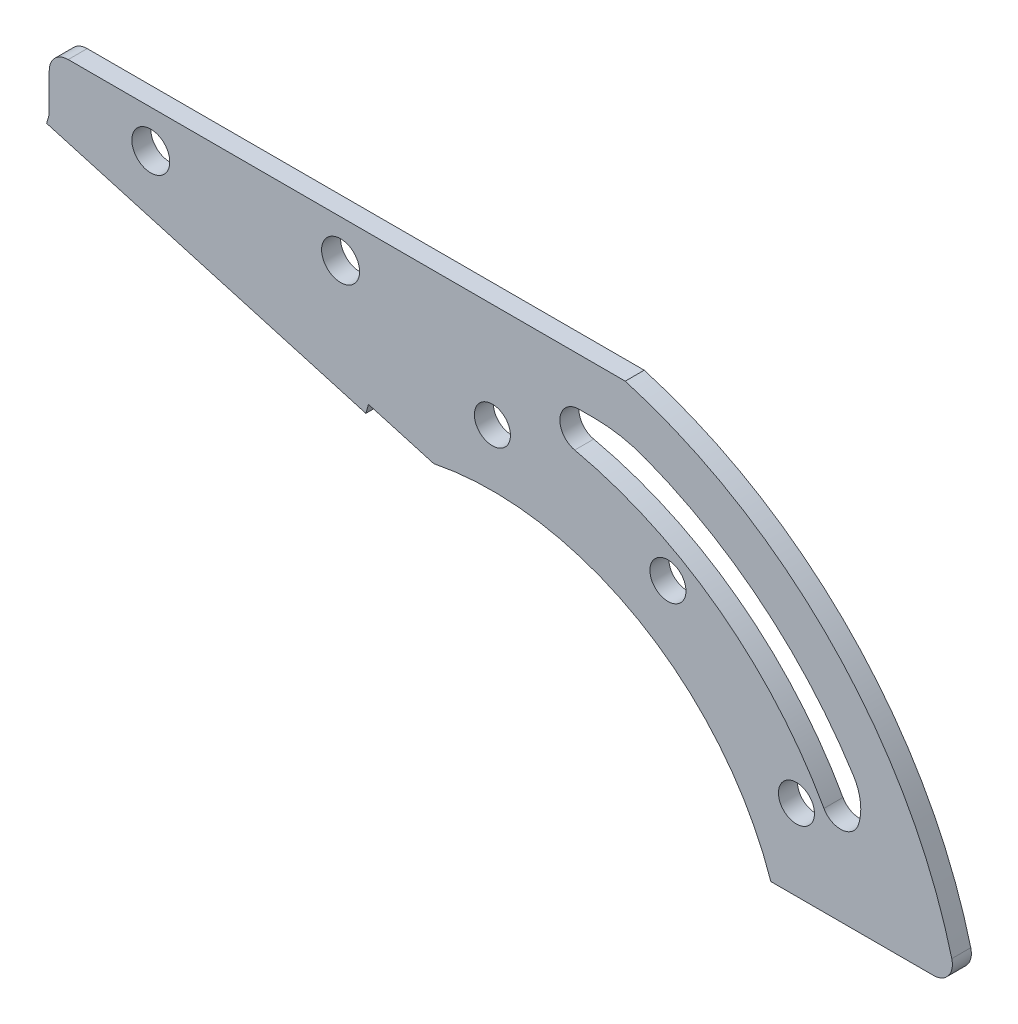
ISO-10303-21;
HEADER;
FILE_DESCRIPTION(('STEP AP214'),'2;1');
FILE_NAME('part.step','',(''),(''),'','','');
FILE_SCHEMA(('AUTOMOTIVE_DESIGN { 1 0 10303 214 1 1 1 1 }'));
ENDSEC;
DATA;
#1=APPLICATION_CONTEXT('core data for automotive mechanical design processes');
#2=APPLICATION_PROTOCOL_DEFINITION('international standard','automotive_design',2000,#1);
#3=PRODUCT_CONTEXT('',#1,'mechanical');
#4=PRODUCT('Part','Part','',(#3));
#5=PRODUCT_RELATED_PRODUCT_CATEGORY('part','',(#4));
#6=PRODUCT_DEFINITION_FORMATION('','',#4);
#7=PRODUCT_DEFINITION_CONTEXT('part definition',#1,'design');
#8=PRODUCT_DEFINITION('design','',#6,#7);
#9=PRODUCT_DEFINITION_SHAPE('','',#8);
#10=(LENGTH_UNIT() NAMED_UNIT(*) SI_UNIT(.MILLI.,.METRE.));
#11=(NAMED_UNIT(*) PLANE_ANGLE_UNIT() SI_UNIT($,.RADIAN.));
#12=(NAMED_UNIT(*) SI_UNIT($,.STERADIAN.) SOLID_ANGLE_UNIT());
#13=UNCERTAINTY_MEASURE_WITH_UNIT(LENGTH_MEASURE(1.E-05),#10,'distance_accuracy_value','');
#14=(GEOMETRIC_REPRESENTATION_CONTEXT(3) GLOBAL_UNCERTAINTY_ASSIGNED_CONTEXT((#13)) GLOBAL_UNIT_ASSIGNED_CONTEXT((#10,
#11,#12)) REPRESENTATION_CONTEXT('',''));
#15=CARTESIAN_POINT('',(0.,0.,0.));
#16=DIRECTION('',(0.,0.,1.));
#17=DIRECTION('',(1.,0.,0.));
#18=AXIS2_PLACEMENT_3D('',#15,#16,#17);
#19=CARTESIAN_POINT('',(0.,0.,0.));
#20=DIRECTION('',(0.,0.,1.));
#21=DIRECTION('',(1.,0.,0.));
#22=AXIS2_PLACEMENT_3D('',#19,#20,#21);
#23=PLANE('',#22);
#24=CARTESIAN_POINT('',(-32.2082171584964,16.055976509107,0.));
#25=DIRECTION('',(0.,0.,-1.));
#26=DIRECTION('',(-1.,0.,0.));
#27=AXIS2_PLACEMENT_3D('',#24,#25,#26);
#28=CIRCLE('',#27,1.99999999999423);
#29=CARTESIAN_POINT('',(-34.2082171584906,16.055976509107,0.));
#30=VERTEX_POINT('',#29);
#31=EDGE_CURVE('E405',#30,#30,#28,.T.);
#32=ORIENTED_EDGE('',*,*,#31,.F.);
#33=EDGE_LOOP('',(#32));
#34=FACE_BOUND('',#33,.T.);
#35=CARTESIAN_POINT('',(-12.2082171584964,16.055976509107,0.));
#36=DIRECTION('',(0.,0.,-1.));
#37=DIRECTION('',(-1.,0.,0.));
#38=AXIS2_PLACEMENT_3D('',#35,#36,#37);
#39=CIRCLE('',#38,1.99999999999423);
#40=CARTESIAN_POINT('',(-14.2082171584906,16.055976509107,0.));
#41=VERTEX_POINT('',#40);
#42=EDGE_CURVE('E409',#41,#41,#39,.T.);
#43=ORIENTED_EDGE('',*,*,#42,.F.);
#44=EDGE_LOOP('',(#43));
#45=FACE_BOUND('',#44,.T.);
#46=CARTESIAN_POINT('',(3.79178284150361,9.05597650910699,0.));
#47=DIRECTION('',(0.,0.,-1.));
#48=DIRECTION('',(-1.,0.,0.));
#49=AXIS2_PLACEMENT_3D('',#46,#47,#48);
#50=CIRCLE('',#49,1.89999999999423);
#51=CARTESIAN_POINT('',(1.89178284150939,9.05597650910699,0.));
#52=VERTEX_POINT('',#51);
#53=EDGE_CURVE('E413',#52,#52,#50,.T.);
#54=ORIENTED_EDGE('',*,*,#53,.F.);
#55=EDGE_LOOP('',(#54));
#56=FACE_BOUND('',#55,.T.);
#57=CARTESIAN_POINT('',(35.8347227815278,-9.44402349089302,0.));
#58=DIRECTION('',(0.,0.,-1.));
#59=DIRECTION('',(-1.,0.,0.));
#60=AXIS2_PLACEMENT_3D('',#57,#58,#59);
#61=CIRCLE('',#60,1.89999999999423);
#62=CARTESIAN_POINT('',(33.9347227815336,-9.44402349089302,0.));
#63=VERTEX_POINT('',#62);
#64=EDGE_CURVE('E417',#63,#63,#61,.T.);
#65=ORIENTED_EDGE('',*,*,#64,.F.);
#66=EDGE_LOOP('',(#65));
#67=FACE_BOUND('',#66,.T.);
#68=CARTESIAN_POINT('',(22.2917828415036,4.09891644913122,0.));
#69=DIRECTION('',(0.,0.,-1.));
#70=DIRECTION('',(-1.,0.,0.));
#71=AXIS2_PLACEMENT_3D('',#68,#69,#70);
#72=CIRCLE('',#71,1.89999999999423);
#73=CARTESIAN_POINT('',(20.3917828415094,4.09891644913122,0.));
#74=VERTEX_POINT('',#73);
#75=EDGE_CURVE('E226',#74,#74,#72,.T.);
#76=ORIENTED_EDGE('',*,*,#75,.F.);
#77=EDGE_LOOP('',(#76));
#78=FACE_BOUND('',#77,.T.);
#79=DIRECTION('',(-1.,0.,0.));
#80=VECTOR('',#79,1.);
#81=CARTESIAN_POINT('',(0.,15.055976509107,0.));
#82=LINE('',#81,#80);
#83=CARTESIAN_POINT('',(14.5621124557727,15.055976509107,0.));
#84=VERTEX_POINT('',#83);
#85=CARTESIAN_POINT('',(12.9022164206479,15.055976509107,0.));
#86=VERTEX_POINT('',#85);
#87=EDGE_CURVE('E240',#84,#86,#82,.T.);
#88=ORIENTED_EDGE('',*,*,#87,.T.);
#89=CARTESIAN_POINT('',(12.9022164206479,13.055976509107,0.));
#90=DIRECTION('',(0.,0.,-1.));
#91=DIRECTION('',(-1.,0.,0.));
#92=AXIS2_PLACEMENT_3D('',#89,#90,#91);
#93=CIRCLE('',#92,2.00000000000004);
#94=CARTESIAN_POINT('',(12.4683862502125,11.103595556726,0.));
#95=VERTEX_POINT('',#94);
#96=EDGE_CURVE('E214',#95,#86,#93,.T.);
#97=ORIENTED_EDGE('',*,*,#96,.F.);
#98=CARTESIAN_POINT('',(3.7917828415036,-27.944023490893,0.));
#99=DIRECTION('',(0.,0.,-1.));
#100=DIRECTION('',(-1.,0.,0.));
#101=AXIS2_PLACEMENT_3D('',#98,#99,#100);
#102=CIRCLE('',#101,39.9999999999999);
#103=CARTESIAN_POINT('',(38.7308562211329,-8.46939508948637,0.));
#104=VERTEX_POINT('',#103);
#105=EDGE_CURVE('E220',#95,#104,#102,.T.);
#106=ORIENTED_EDGE('',*,*,#105,.T.);
#107=CARTESIAN_POINT('',(40.4778098901144,-7.49566366941601,0.));
#108=DIRECTION('',(0.,0.,-1.));
#109=DIRECTION('',(-1.,0.,0.));
#110=AXIS2_PLACEMENT_3D('',#107,#108,#109);
#111=CIRCLE('',#110,2.00000000000007);
#112=CARTESIAN_POINT('',(42.3152259592522,-8.2855384625791,0.));
#113=VERTEX_POINT('',#112);
#114=EDGE_CURVE('E223',#113,#104,#111,.T.);
#115=ORIENTED_EDGE('',*,*,#114,.F.);
#116=CARTESIAN_POINT('',(37.6127420356404,-6.58652552908724,0.));
#117=DIRECTION('',(0.,0.,-1.));
#118=DIRECTION('',(-1.,0.,0.));
#119=AXIS2_PLACEMENT_3D('',#116,#117,#118);
#120=CIRCLE('',#119,5.);
#121=CARTESIAN_POINT('',(41.8403619349075,-3.91683828386151,0.));
#122=VERTEX_POINT('',#121);
#123=EDGE_CURVE('E249',#122,#113,#120,.T.);
#124=ORIENTED_EDGE('',*,*,#123,.F.);
#125=CARTESIAN_POINT('',(3.7917828415036,-27.944023490893,0.));
#126=DIRECTION('',(0.,0.,-1.));
#127=DIRECTION('',(-1.,0.,0.));
#128=AXIS2_PLACEMENT_3D('',#125,#126,#127);
#129=CIRCLE('',#128,45.);
#130=CARTESIAN_POINT('',(19.9472772629072,14.055976509107,0.));
#131=VERTEX_POINT('',#130);
#132=EDGE_CURVE('E246',#131,#122,#129,.T.);
#133=ORIENTED_EDGE('',*,*,#132,.F.);
#134=CARTESIAN_POINT('',(14.5621124557727,0.0559765091069954,0.));
#135=DIRECTION('',(0.,0.,-1.));
#136=DIRECTION('',(-1.,0.,0.));
#137=AXIS2_PLACEMENT_3D('',#134,#135,#136);
#138=CIRCLE('',#137,15.);
#139=EDGE_CURVE('E243',#84,#131,#138,.T.);
#140=ORIENTED_EDGE('',*,*,#139,.F.);
#141=EDGE_LOOP('',(#88,#97,#106,#115,#124,#133,#140));
#142=FACE_BOUND('',#141,.T.);
#143=CARTESIAN_POINT('',(50.2675829959926,-15.944023490893,0.));
#144=DIRECTION('',(0.,0.,-1.));
#145=DIRECTION('',(-1.,0.,0.));
#146=AXIS2_PLACEMENT_3D('',#143,#144,#145);
#147=CIRCLE('',#146,2.00000000000001);
#148=CARTESIAN_POINT('',(52.2040746690963,-15.444023490893,0.));
#149=VERTEX_POINT('',#148);
#150=CARTESIAN_POINT('',(50.2675829959926,-17.944023490893,0.));
#151=VERTEX_POINT('',#150);
#152=EDGE_CURVE('E256',#149,#151,#147,.T.);
#153=ORIENTED_EDGE('',*,*,#152,.T.);
#154=DIRECTION('',(-1.,0.,0.));
#155=VECTOR('',#154,1.);
#156=CARTESIAN_POINT('',(0.,-17.944023490893,0.));
#157=LINE('',#156,#155);
#158=CARTESIAN_POINT('',(33.134584343746,-17.944023490893,0.));
#159=VERTEX_POINT('',#158);
#160=EDGE_CURVE('E269',#151,#159,#157,.T.);
#161=ORIENTED_EDGE('',*,*,#160,.T.);
#162=CARTESIAN_POINT('',(3.7917828415036,-27.944023490893,0.));
#163=DIRECTION('',(0.,0.,-1.));
#164=DIRECTION('',(-1.,0.,0.));
#165=AXIS2_PLACEMENT_3D('',#162,#163,#164);
#166=CIRCLE('',#165,31.);
#167=CARTESIAN_POINT('',(-2.3829680921706,2.43479233374192,0.));
#168=VERTEX_POINT('',#167);
#169=EDGE_CURVE('E316',#168,#159,#166,.T.);
#170=ORIENTED_EDGE('',*,*,#169,.F.);
#171=DIRECTION('',(-0.961261695938321,0.275637355816991,0.));
#172=VECTOR('',#171,1.);
#173=CARTESIAN_POINT('',(0.464073411826669,1.61841631940691,0.));
#174=LINE('',#173,#172);
#175=CARTESIAN_POINT('',(-9.266694282034,4.40866905551224,0.));
#176=VERTEX_POINT('',#175);
#177=EDGE_CURVE('E313',#168,#176,#174,.T.);
#178=ORIENTED_EDGE('',*,*,#177,.T.);
#179=DIRECTION('',(-0.275637355816985,-0.961261695938323,0.));
#180=VECTOR('',#179,1.);
#181=CARTESIAN_POINT('',(-9.73076769386068,2.79025273610527,0.));
#182=LINE('',#181,#180);
#183=CARTESIAN_POINT('',(-9.54233163785098,3.44740735957393,0.));
#184=VERTEX_POINT('',#183);
#185=EDGE_CURVE('E310',#176,#184,#182,.T.);
#186=ORIENTED_EDGE('',*,*,#185,.T.);
#187=DIRECTION('',(-0.961261695938321,0.275637355816992,0.));
#188=VECTOR('',#187,1.);
#189=CARTESIAN_POINT('',(0.188436056009683,0.657154623468601,0.));
#190=LINE('',#189,#188);
#191=CARTESIAN_POINT('',(-43.1864909956922,13.0947148131687,0.));
#192=VERTEX_POINT('',#191);
#193=EDGE_CURVE('E307',#184,#192,#190,.T.);
#194=ORIENTED_EDGE('',*,*,#193,.T.);
#195=DIRECTION('',(0.275637355816996,0.96126169593832,0.));
#196=VECTOR('',#195,1.);
#197=CARTESIAN_POINT('',(-43.3749270517019,12.4375601897003,0.));
#198=LINE('',#197,#196);
#199=CARTESIAN_POINT('',(-42.9108536398752,14.055976509107,0.));
#200=VERTEX_POINT('',#199);
#201=EDGE_CURVE('E304',#192,#200,#198,.T.);
#202=ORIENTED_EDGE('',*,*,#201,.T.);
#203=DIRECTION('',(0.,1.,0.));
#204=VECTOR('',#203,1.);
#205=CARTESIAN_POINT('',(-42.9108536398752,0.,0.));
#206=LINE('',#205,#204);
#207=CARTESIAN_POINT('',(-42.9108536398752,18.055976509107,0.));
#208=VERTEX_POINT('',#207);
#209=EDGE_CURVE('E301',#200,#208,#206,.T.);
#210=ORIENTED_EDGE('',*,*,#209,.T.);
#211=CARTESIAN_POINT('',(-40.9108536398752,18.055976509107,0.));
#212=DIRECTION('',(0.,0.,-1.));
#213=DIRECTION('',(-1.,0.,0.));
#214=AXIS2_PLACEMENT_3D('',#211,#212,#213);
#215=CIRCLE('',#214,2.);
#216=CARTESIAN_POINT('',(-40.9108536398752,20.055976509107,0.));
#217=VERTEX_POINT('',#216);
#218=EDGE_CURVE('E298',#208,#217,#215,.T.);
#219=ORIENTED_EDGE('',*,*,#218,.T.);
#220=DIRECTION('',(1.,0.,0.));
#221=VECTOR('',#220,1.);
#222=CARTESIAN_POINT('',(0.,20.055976509107,0.));
#223=LINE('',#222,#221);
#224=CARTESIAN_POINT('',(17.7917828415037,20.055976509107,0.));
#225=VERTEX_POINT('',#224);
#226=EDGE_CURVE('E295',#217,#225,#223,.T.);
#227=ORIENTED_EDGE('',*,*,#226,.T.);
#228=CARTESIAN_POINT('',(3.7917828415036,-27.944023490893,0.));
#229=DIRECTION('',(0.,0.,-1.));
#230=DIRECTION('',(-1.,0.,0.));
#231=AXIS2_PLACEMENT_3D('',#228,#229,#230);
#232=CIRCLE('',#231,50.);
#233=EDGE_CURVE('E292',#225,#149,#232,.T.);
#234=ORIENTED_EDGE('',*,*,#233,.T.);
#235=EDGE_LOOP('',(#153,#161,#170,#178,#186,#194,#202,#210,#219,#227,#234));
#236=FACE_BOUND('',#235,.T.);
#237=ADVANCED_FACE('F72',(#34,#45,#56,#67,#78,#142,#236),#23,.F.);
#238=CARTESIAN_POINT('',(50.2675829959926,-15.944023490893,2.));
#239=DIRECTION('',(0.,0.,-1.));
#240=DIRECTION('',(-1.,0.,0.));
#241=AXIS2_PLACEMENT_3D('',#238,#239,#240);
#242=CYLINDRICAL_SURFACE('',#241,2.00000000000001);
#243=ORIENTED_EDGE('',*,*,#152,.F.);
#244=DIRECTION('',(0.,0.,-1.));
#245=VECTOR('',#244,1.);
#246=CARTESIAN_POINT('',(52.2040746690963,-15.444023490893,2.));
#247=LINE('',#246,#245);
#248=CARTESIAN_POINT('',(52.2040746690963,-15.444023490893,2.));
#249=VERTEX_POINT('',#248);
#250=EDGE_CURVE('E75',#249,#149,#247,.T.);
#251=ORIENTED_EDGE('',*,*,#250,.F.);
#252=CARTESIAN_POINT('',(50.2675829959926,-15.944023490893,2.));
#253=DIRECTION('',(0.,0.,-1.));
#254=DIRECTION('',(-1.,0.,0.));
#255=AXIS2_PLACEMENT_3D('',#252,#253,#254);
#256=CIRCLE('',#255,2.00000000000001);
#257=CARTESIAN_POINT('',(50.2675829959926,-17.944023490893,2.));
#258=VERTEX_POINT('',#257);
#259=EDGE_CURVE('E266',#249,#258,#256,.T.);
#260=ORIENTED_EDGE('',*,*,#259,.T.);
#261=DIRECTION('',(0.,0.,-1.));
#262=VECTOR('',#261,1.);
#263=CARTESIAN_POINT('',(50.2675829959926,-17.944023490893,2.));
#264=LINE('',#263,#262);
#265=EDGE_CURVE('E12',#258,#151,#264,.T.);
#266=ORIENTED_EDGE('',*,*,#265,.T.);
#267=EDGE_LOOP('',(#243,#251,#260,#266));
#268=FACE_BOUND('',#267,.T.);
#269=ADVANCED_FACE('F353',(#268),#242,.T.);
#270=CARTESIAN_POINT('',(0.,-17.944023490893,2.));
#271=DIRECTION('',(0.,-1.,0.));
#272=DIRECTION('',(0.,0.,-1.));
#273=AXIS2_PLACEMENT_3D('',#270,#271,#272);
#274=PLANE('',#273);
#275=ORIENTED_EDGE('',*,*,#160,.F.);
#276=ORIENTED_EDGE('',*,*,#265,.F.);
#277=DIRECTION('',(-1.,0.,0.));
#278=VECTOR('',#277,1.);
#279=CARTESIAN_POINT('',(0.,-17.944023490893,2.));
#280=LINE('',#279,#278);
#281=CARTESIAN_POINT('',(33.134584343746,-17.944023490893,2.));
#282=VERTEX_POINT('',#281);
#283=EDGE_CURVE('E288',#258,#282,#280,.T.);
#284=ORIENTED_EDGE('',*,*,#283,.T.);
#285=DIRECTION('',(0.,0.,-1.));
#286=VECTOR('',#285,1.);
#287=CARTESIAN_POINT('',(33.134584343746,-17.944023490893,2.));
#288=LINE('',#287,#286);
#289=EDGE_CURVE('E80',#282,#159,#288,.T.);
#290=ORIENTED_EDGE('',*,*,#289,.T.);
#291=EDGE_LOOP('',(#275,#276,#284,#290));
#292=FACE_BOUND('',#291,.T.);
#293=ADVANCED_FACE('F355',(#292),#274,.T.);
#294=CARTESIAN_POINT('',(3.7917828415036,-27.944023490893,2.));
#295=DIRECTION('',(0.,0.,-1.));
#296=DIRECTION('',(-1.,0.,0.));
#297=AXIS2_PLACEMENT_3D('',#294,#295,#296);
#298=CYLINDRICAL_SURFACE('',#297,31.);
#299=ORIENTED_EDGE('',*,*,#169,.T.);
#300=ORIENTED_EDGE('',*,*,#289,.F.);
#301=CARTESIAN_POINT('',(3.7917828415036,-27.944023490893,2.));
#302=DIRECTION('',(0.,0.,-1.));
#303=DIRECTION('',(-1.,0.,0.));
#304=AXIS2_PLACEMENT_3D('',#301,#302,#303);
#305=CIRCLE('',#304,31.);
#306=CARTESIAN_POINT('',(-2.3829680921706,2.43479233374192,2.));
#307=VERTEX_POINT('',#306);
#308=EDGE_CURVE('E285',#307,#282,#305,.T.);
#309=ORIENTED_EDGE('',*,*,#308,.F.);
#310=DIRECTION('',(0.,0.,-1.));
#311=VECTOR('',#310,1.);
#312=CARTESIAN_POINT('',(-2.3829680921706,2.43479233374192,2.));
#313=LINE('',#312,#311);
#314=EDGE_CURVE('E322',#307,#168,#313,.T.);
#315=ORIENTED_EDGE('',*,*,#314,.T.);
#316=EDGE_LOOP('',(#299,#300,#309,#315));
#317=FACE_BOUND('',#316,.T.);
#318=ADVANCED_FACE('F360',(#317),#298,.F.);
#319=CARTESIAN_POINT('',(0.464073411826669,1.61841631940691,2.));
#320=DIRECTION('',(-0.275637355816991,-0.961261695938321,0.));
#321=DIRECTION('',(0.961261695938321,-0.275637355816991,0.));
#322=AXIS2_PLACEMENT_3D('',#319,#320,#321);
#323=PLANE('',#322);
#324=ORIENTED_EDGE('',*,*,#177,.F.);
#325=ORIENTED_EDGE('',*,*,#314,.F.);
#326=DIRECTION('',(-0.961261695938321,0.275637355816991,0.));
#327=VECTOR('',#326,1.);
#328=CARTESIAN_POINT('',(0.464073411826669,1.61841631940691,2.));
#329=LINE('',#328,#327);
#330=CARTESIAN_POINT('',(-9.266694282034,4.40866905551224,2.));
#331=VERTEX_POINT('',#330);
#332=EDGE_CURVE('E283',#307,#331,#329,.T.);
#333=ORIENTED_EDGE('',*,*,#332,.T.);
#334=DIRECTION('',(0.,0.,-1.));
#335=VECTOR('',#334,1.);
#336=CARTESIAN_POINT('',(-9.266694282034,4.40866905551224,2.));
#337=LINE('',#336,#335);
#338=EDGE_CURVE('E324',#331,#176,#337,.T.);
#339=ORIENTED_EDGE('',*,*,#338,.T.);
#340=EDGE_LOOP('',(#324,#325,#333,#339));
#341=FACE_BOUND('',#340,.T.);
#342=ADVANCED_FACE('F364',(#341),#323,.T.);
#343=CARTESIAN_POINT('',(-9.73076769386068,2.79025273610527,2.));
#344=DIRECTION('',(0.961261695938323,-0.275637355816985,0.));
#345=DIRECTION('',(0.275637355816985,0.961261695938323,0.));
#346=AXIS2_PLACEMENT_3D('',#343,#344,#345);
#347=PLANE('',#346);
#348=ORIENTED_EDGE('',*,*,#185,.F.);
#349=ORIENTED_EDGE('',*,*,#338,.F.);
#350=DIRECTION('',(-0.275637355816985,-0.961261695938323,0.));
#351=VECTOR('',#350,1.);
#352=CARTESIAN_POINT('',(-9.73076769386068,2.79025273610527,2.));
#353=LINE('',#352,#351);
#354=CARTESIAN_POINT('',(-9.54233163785098,3.44740735957393,2.));
#355=VERTEX_POINT('',#354);
#356=EDGE_CURVE('E281',#331,#355,#353,.T.);
#357=ORIENTED_EDGE('',*,*,#356,.T.);
#358=DIRECTION('',(0.,0.,-1.));
#359=VECTOR('',#358,1.);
#360=CARTESIAN_POINT('',(-9.54233163785098,3.44740735957393,2.));
#361=LINE('',#360,#359);
#362=EDGE_CURVE('E326',#355,#184,#361,.T.);
#363=ORIENTED_EDGE('',*,*,#362,.T.);
#364=EDGE_LOOP('',(#348,#349,#357,#363));
#365=FACE_BOUND('',#364,.T.);
#366=ADVANCED_FACE('F369',(#365),#347,.T.);
#367=CARTESIAN_POINT('',(0.188436056009683,0.657154623468601,2.));
#368=DIRECTION('',(-0.275637355816992,-0.961261695938321,0.));
#369=DIRECTION('',(0.961261695938321,-0.275637355816992,0.));
#370=AXIS2_PLACEMENT_3D('',#367,#368,#369);
#371=PLANE('',#370);
#372=ORIENTED_EDGE('',*,*,#193,.F.);
#373=ORIENTED_EDGE('',*,*,#362,.F.);
#374=DIRECTION('',(-0.961261695938321,0.275637355816992,0.));
#375=VECTOR('',#374,1.);
#376=CARTESIAN_POINT('',(0.188436056009683,0.657154623468601,2.));
#377=LINE('',#376,#375);
#378=CARTESIAN_POINT('',(-43.1864909956922,13.0947148131687,2.));
#379=VERTEX_POINT('',#378);
#380=EDGE_CURVE('E279',#355,#379,#377,.T.);
#381=ORIENTED_EDGE('',*,*,#380,.T.);
#382=DIRECTION('',(0.,0.,-1.));
#383=VECTOR('',#382,1.);
#384=CARTESIAN_POINT('',(-43.1864909956922,13.0947148131687,2.));
#385=LINE('',#384,#383);
#386=EDGE_CURVE('E328',#379,#192,#385,.T.);
#387=ORIENTED_EDGE('',*,*,#386,.T.);
#388=EDGE_LOOP('',(#372,#373,#381,#387));
#389=FACE_BOUND('',#388,.T.);
#390=ADVANCED_FACE('F374',(#389),#371,.T.);
#391=CARTESIAN_POINT('',(-43.3749270517019,12.4375601897003,2.));
#392=DIRECTION('',(-0.96126169593832,0.275637355816996,0.));
#393=DIRECTION('',(-0.275637355816996,-0.96126169593832,0.));
#394=AXIS2_PLACEMENT_3D('',#391,#392,#393);
#395=PLANE('',#394);
#396=ORIENTED_EDGE('',*,*,#201,.F.);
#397=ORIENTED_EDGE('',*,*,#386,.F.);
#398=DIRECTION('',(0.275637355816996,0.96126169593832,0.));
#399=VECTOR('',#398,1.);
#400=CARTESIAN_POINT('',(-43.3749270517019,12.4375601897003,2.));
#401=LINE('',#400,#399);
#402=CARTESIAN_POINT('',(-42.9108536398752,14.055976509107,2.));
#403=VERTEX_POINT('',#402);
#404=EDGE_CURVE('E277',#379,#403,#401,.T.);
#405=ORIENTED_EDGE('',*,*,#404,.T.);
#406=DIRECTION('',(0.,0.,-1.));
#407=VECTOR('',#406,1.);
#408=CARTESIAN_POINT('',(-42.9108536398752,14.055976509107,2.));
#409=LINE('',#408,#407);
#410=EDGE_CURVE('E330',#403,#200,#409,.T.);
#411=ORIENTED_EDGE('',*,*,#410,.T.);
#412=EDGE_LOOP('',(#396,#397,#405,#411));
#413=FACE_BOUND('',#412,.T.);
#414=ADVANCED_FACE('F379',(#413),#395,.T.);
#415=CARTESIAN_POINT('',(-42.9108536398752,0.,2.));
#416=DIRECTION('',(-1.,0.,0.));
#417=DIRECTION('',(0.,0.,1.));
#418=AXIS2_PLACEMENT_3D('',#415,#416,#417);
#419=PLANE('',#418);
#420=ORIENTED_EDGE('',*,*,#209,.F.);
#421=ORIENTED_EDGE('',*,*,#410,.F.);
#422=DIRECTION('',(0.,1.,0.));
#423=VECTOR('',#422,1.);
#424=CARTESIAN_POINT('',(-42.9108536398752,0.,2.));
#425=LINE('',#424,#423);
#426=CARTESIAN_POINT('',(-42.9108536398752,18.055976509107,2.));
#427=VERTEX_POINT('',#426);
#428=EDGE_CURVE('E275',#403,#427,#425,.T.);
#429=ORIENTED_EDGE('',*,*,#428,.T.);
#430=DIRECTION('',(0.,0.,-1.));
#431=VECTOR('',#430,1.);
#432=CARTESIAN_POINT('',(-42.9108536398752,18.055976509107,2.));
#433=LINE('',#432,#431);
#434=EDGE_CURVE('E332',#427,#208,#433,.T.);
#435=ORIENTED_EDGE('',*,*,#434,.T.);
#436=EDGE_LOOP('',(#420,#421,#429,#435));
#437=FACE_BOUND('',#436,.T.);
#438=ADVANCED_FACE('F383',(#437),#419,.T.);
#439=CARTESIAN_POINT('',(-40.9108536398752,18.055976509107,2.));
#440=DIRECTION('',(0.,0.,-1.));
#441=DIRECTION('',(-1.,0.,0.));
#442=AXIS2_PLACEMENT_3D('',#439,#440,#441);
#443=CYLINDRICAL_SURFACE('',#442,2.);
#444=ORIENTED_EDGE('',*,*,#218,.F.);
#445=ORIENTED_EDGE('',*,*,#434,.F.);
#446=CARTESIAN_POINT('',(-40.9108536398752,18.055976509107,2.));
#447=DIRECTION('',(0.,0.,-1.));
#448=DIRECTION('',(-1.,0.,0.));
#449=AXIS2_PLACEMENT_3D('',#446,#447,#448);
#450=CIRCLE('',#449,2.);
#451=CARTESIAN_POINT('',(-40.9108536398752,20.055976509107,2.));
#452=VERTEX_POINT('',#451);
#453=EDGE_CURVE('E273',#427,#452,#450,.T.);
#454=ORIENTED_EDGE('',*,*,#453,.T.);
#455=DIRECTION('',(0.,0.,-1.));
#456=VECTOR('',#455,1.);
#457=CARTESIAN_POINT('',(-40.9108536398752,20.055976509107,2.));
#458=LINE('',#457,#456);
#459=EDGE_CURVE('E334',#452,#217,#458,.T.);
#460=ORIENTED_EDGE('',*,*,#459,.T.);
#461=EDGE_LOOP('',(#444,#445,#454,#460));
#462=FACE_BOUND('',#461,.T.);
#463=ADVANCED_FACE('F385',(#462),#443,.T.);
#464=CARTESIAN_POINT('',(0.,20.055976509107,2.));
#465=DIRECTION('',(0.,1.,0.));
#466=DIRECTION('',(0.,0.,1.));
#467=AXIS2_PLACEMENT_3D('',#464,#465,#466);
#468=PLANE('',#467);
#469=ORIENTED_EDGE('',*,*,#226,.F.);
#470=ORIENTED_EDGE('',*,*,#459,.F.);
#471=DIRECTION('',(1.,0.,0.));
#472=VECTOR('',#471,1.);
#473=CARTESIAN_POINT('',(0.,20.055976509107,2.));
#474=LINE('',#473,#472);
#475=CARTESIAN_POINT('',(17.7917828415037,20.055976509107,2.));
#476=VERTEX_POINT('',#475);
#477=EDGE_CURVE('E271',#452,#476,#474,.T.);
#478=ORIENTED_EDGE('',*,*,#477,.T.);
#479=DIRECTION('',(0.,0.,-1.));
#480=VECTOR('',#479,1.);
#481=CARTESIAN_POINT('',(17.7917828415037,20.055976509107,2.));
#482=LINE('',#481,#480);
#483=EDGE_CURVE('E96',#476,#225,#482,.T.);
#484=ORIENTED_EDGE('',*,*,#483,.T.);
#485=EDGE_LOOP('',(#469,#470,#478,#484));
#486=FACE_BOUND('',#485,.T.);
#487=ADVANCED_FACE('F346',(#486),#468,.T.);
#488=CARTESIAN_POINT('',(3.7917828415036,-27.944023490893,2.));
#489=DIRECTION('',(0.,0.,-1.));
#490=DIRECTION('',(-1.,0.,0.));
#491=AXIS2_PLACEMENT_3D('',#488,#489,#490);
#492=CYLINDRICAL_SURFACE('',#491,50.);
#493=ORIENTED_EDGE('',*,*,#233,.F.);
#494=ORIENTED_EDGE('',*,*,#483,.F.);
#495=CARTESIAN_POINT('',(3.7917828415036,-27.944023490893,2.));
#496=DIRECTION('',(0.,0.,-1.));
#497=DIRECTION('',(-1.,0.,0.));
#498=AXIS2_PLACEMENT_3D('',#495,#496,#497);
#499=CIRCLE('',#498,50.);
#500=EDGE_CURVE('E268',#476,#249,#499,.T.);
#501=ORIENTED_EDGE('',*,*,#500,.T.);
#502=ORIENTED_EDGE('',*,*,#250,.T.);
#503=EDGE_LOOP('',(#493,#494,#501,#502));
#504=FACE_BOUND('',#503,.T.);
#505=ADVANCED_FACE('F339',(#504),#492,.T.);
#506=CARTESIAN_POINT('',(12.9022164206479,13.055976509107,2.));
#507=DIRECTION('',(0.,0.,-1.));
#508=DIRECTION('',(-1.,0.,0.));
#509=AXIS2_PLACEMENT_3D('',#506,#507,#508);
#510=CYLINDRICAL_SURFACE('',#509,2.00000000000004);
#511=ORIENTED_EDGE('',*,*,#96,.T.);
#512=DIRECTION('',(0.,0.,-1.));
#513=VECTOR('',#512,1.);
#514=CARTESIAN_POINT('',(12.9022164206479,15.055976509107,2.));
#515=LINE('',#514,#513);
#516=CARTESIAN_POINT('',(12.9022164206479,15.055976509107,2.));
#517=VERTEX_POINT('',#516);
#518=EDGE_CURVE('E202',#517,#86,#515,.T.);
#519=ORIENTED_EDGE('',*,*,#518,.F.);
#520=CARTESIAN_POINT('',(12.9022164206479,13.055976509107,2.));
#521=DIRECTION('',(0.,0.,-1.));
#522=DIRECTION('',(-1.,0.,0.));
#523=AXIS2_PLACEMENT_3D('',#520,#521,#522);
#524=CIRCLE('',#523,2.00000000000004);
#525=CARTESIAN_POINT('',(12.4683862502125,11.103595556726,2.));
#526=VERTEX_POINT('',#525);
#527=EDGE_CURVE('E207',#526,#517,#524,.T.);
#528=ORIENTED_EDGE('',*,*,#527,.F.);
#529=DIRECTION('',(0.,0.,-1.));
#530=VECTOR('',#529,1.);
#531=CARTESIAN_POINT('',(12.4683862502125,11.103595556726,2.));
#532=LINE('',#531,#530);
#533=EDGE_CURVE('E254',#526,#95,#532,.T.);
#534=ORIENTED_EDGE('',*,*,#533,.T.);
#535=EDGE_LOOP('',(#511,#519,#528,#534));
#536=FACE_BOUND('',#535,.T.);
#537=ADVANCED_FACE('F211',(#536),#510,.F.);
#538=CARTESIAN_POINT('',(3.7917828415036,-27.944023490893,2.));
#539=DIRECTION('',(0.,0.,-1.));
#540=DIRECTION('',(-1.,0.,0.));
#541=AXIS2_PLACEMENT_3D('',#538,#539,#540);
#542=CYLINDRICAL_SURFACE('',#541,39.9999999999999);
#543=ORIENTED_EDGE('',*,*,#105,.F.);
#544=ORIENTED_EDGE('',*,*,#533,.F.);
#545=CARTESIAN_POINT('',(3.7917828415036,-27.944023490893,2.));
#546=DIRECTION('',(0.,0.,-1.));
#547=DIRECTION('',(-1.,0.,0.));
#548=AXIS2_PLACEMENT_3D('',#545,#546,#547);
#549=CIRCLE('',#548,39.9999999999999);
#550=CARTESIAN_POINT('',(38.7308562211329,-8.46939508948637,2.));
#551=VERTEX_POINT('',#550);
#552=EDGE_CURVE('E215',#526,#551,#549,.T.);
#553=ORIENTED_EDGE('',*,*,#552,.T.);
#554=DIRECTION('',(0.,0.,-1.));
#555=VECTOR('',#554,1.);
#556=CARTESIAN_POINT('',(38.7308562211329,-8.46939508948637,2.));
#557=LINE('',#556,#555);
#558=EDGE_CURVE('E257',#551,#104,#557,.T.);
#559=ORIENTED_EDGE('',*,*,#558,.T.);
#560=EDGE_LOOP('',(#543,#544,#553,#559));
#561=FACE_BOUND('',#560,.T.);
#562=ADVANCED_FACE('F438',(#561),#542,.T.);
#563=CARTESIAN_POINT('',(40.4778098901144,-7.49566366941601,2.));
#564=DIRECTION('',(0.,0.,-1.));
#565=DIRECTION('',(-1.,0.,0.));
#566=AXIS2_PLACEMENT_3D('',#563,#564,#565);
#567=CYLINDRICAL_SURFACE('',#566,2.00000000000007);
#568=ORIENTED_EDGE('',*,*,#114,.T.);
#569=ORIENTED_EDGE('',*,*,#558,.F.);
#570=CARTESIAN_POINT('',(40.4778098901144,-7.49566366941601,2.));
#571=DIRECTION('',(0.,0.,-1.));
#572=DIRECTION('',(-1.,0.,0.));
#573=AXIS2_PLACEMENT_3D('',#570,#571,#572);
#574=CIRCLE('',#573,2.00000000000007);
#575=CARTESIAN_POINT('',(42.3152259592522,-8.2855384625791,2.));
#576=VERTEX_POINT('',#575);
#577=EDGE_CURVE('E236',#576,#551,#574,.T.);
#578=ORIENTED_EDGE('',*,*,#577,.F.);
#579=DIRECTION('',(0.,0.,-1.));
#580=VECTOR('',#579,1.);
#581=CARTESIAN_POINT('',(42.3152259592522,-8.2855384625791,2.));
#582=LINE('',#581,#580);
#583=EDGE_CURVE('E259',#576,#113,#582,.T.);
#584=ORIENTED_EDGE('',*,*,#583,.T.);
#585=EDGE_LOOP('',(#568,#569,#578,#584));
#586=FACE_BOUND('',#585,.T.);
#587=ADVANCED_FACE('F435',(#586),#567,.F.);
#588=CARTESIAN_POINT('',(37.6127420356404,-6.58652552908724,2.));
#589=DIRECTION('',(0.,0.,-1.));
#590=DIRECTION('',(-1.,0.,0.));
#591=AXIS2_PLACEMENT_3D('',#588,#589,#590);
#592=CYLINDRICAL_SURFACE('',#591,5.);
#593=ORIENTED_EDGE('',*,*,#123,.T.);
#594=ORIENTED_EDGE('',*,*,#583,.F.);
#595=CARTESIAN_POINT('',(37.6127420356404,-6.58652552908724,2.));
#596=DIRECTION('',(0.,0.,-1.));
#597=DIRECTION('',(-1.,0.,0.));
#598=AXIS2_PLACEMENT_3D('',#595,#596,#597);
#599=CIRCLE('',#598,5.);
#600=CARTESIAN_POINT('',(41.8403619349075,-3.91683828386151,2.));
#601=VERTEX_POINT('',#600);
#602=EDGE_CURVE('E233',#601,#576,#599,.T.);
#603=ORIENTED_EDGE('',*,*,#602,.F.);
#604=DIRECTION('',(0.,0.,-1.));
#605=VECTOR('',#604,1.);
#606=CARTESIAN_POINT('',(41.8403619349075,-3.91683828386151,2.));
#607=LINE('',#606,#605);
#608=EDGE_CURVE('E261',#601,#122,#607,.T.);
#609=ORIENTED_EDGE('',*,*,#608,.T.);
#610=EDGE_LOOP('',(#593,#594,#603,#609));
#611=FACE_BOUND('',#610,.T.);
#612=ADVANCED_FACE('F431',(#611),#592,.F.);
#613=CARTESIAN_POINT('',(3.7917828415036,-27.944023490893,2.));
#614=DIRECTION('',(0.,0.,-1.));
#615=DIRECTION('',(-1.,0.,0.));
#616=AXIS2_PLACEMENT_3D('',#613,#614,#615);
#617=CYLINDRICAL_SURFACE('',#616,45.);
#618=ORIENTED_EDGE('',*,*,#132,.T.);
#619=ORIENTED_EDGE('',*,*,#608,.F.);
#620=CARTESIAN_POINT('',(3.7917828415036,-27.944023490893,2.));
#621=DIRECTION('',(0.,0.,-1.));
#622=DIRECTION('',(-1.,0.,0.));
#623=AXIS2_PLACEMENT_3D('',#620,#621,#622);
#624=CIRCLE('',#623,45.);
#625=CARTESIAN_POINT('',(19.9472772629072,14.055976509107,2.));
#626=VERTEX_POINT('',#625);
#627=EDGE_CURVE('E230',#626,#601,#624,.T.);
#628=ORIENTED_EDGE('',*,*,#627,.F.);
#629=DIRECTION('',(0.,0.,-1.));
#630=VECTOR('',#629,1.);
#631=CARTESIAN_POINT('',(19.9472772629072,14.055976509107,2.));
#632=LINE('',#631,#630);
#633=EDGE_CURVE('E263',#626,#131,#632,.T.);
#634=ORIENTED_EDGE('',*,*,#633,.T.);
#635=EDGE_LOOP('',(#618,#619,#628,#634));
#636=FACE_BOUND('',#635,.T.);
#637=ADVANCED_FACE('F427',(#636),#617,.F.);
#638=CARTESIAN_POINT('',(14.5621124557727,0.0559765091069954,2.));
#639=DIRECTION('',(0.,0.,-1.));
#640=DIRECTION('',(-1.,0.,0.));
#641=AXIS2_PLACEMENT_3D('',#638,#639,#640);
#642=CYLINDRICAL_SURFACE('',#641,15.);
#643=ORIENTED_EDGE('',*,*,#139,.T.);
#644=ORIENTED_EDGE('',*,*,#633,.F.);
#645=CARTESIAN_POINT('',(14.5621124557727,0.0559765091069954,2.));
#646=DIRECTION('',(0.,0.,-1.));
#647=DIRECTION('',(-1.,0.,0.));
#648=AXIS2_PLACEMENT_3D('',#645,#646,#647);
#649=CIRCLE('',#648,15.);
#650=CARTESIAN_POINT('',(14.5621124557727,15.055976509107,2.));
#651=VERTEX_POINT('',#650);
#652=EDGE_CURVE('E88',#651,#626,#649,.T.);
#653=ORIENTED_EDGE('',*,*,#652,.F.);
#654=DIRECTION('',(0.,0.,-1.));
#655=VECTOR('',#654,1.);
#656=CARTESIAN_POINT('',(14.5621124557727,15.055976509107,2.));
#657=LINE('',#656,#655);
#658=EDGE_CURVE('E204',#651,#84,#657,.T.);
#659=ORIENTED_EDGE('',*,*,#658,.T.);
#660=EDGE_LOOP('',(#643,#644,#653,#659));
#661=FACE_BOUND('',#660,.T.);
#662=ADVANCED_FACE('F424',(#661),#642,.F.);
#663=CARTESIAN_POINT('',(0.,15.055976509107,2.));
#664=DIRECTION('',(0.,-1.,0.));
#665=DIRECTION('',(0.,0.,-1.));
#666=AXIS2_PLACEMENT_3D('',#663,#664,#665);
#667=PLANE('',#666);
#668=ORIENTED_EDGE('',*,*,#87,.F.);
#669=ORIENTED_EDGE('',*,*,#658,.F.);
#670=DIRECTION('',(-1.,0.,0.));
#671=VECTOR('',#670,1.);
#672=CARTESIAN_POINT('',(0.,15.055976509107,2.));
#673=LINE('',#672,#671);
#674=EDGE_CURVE('E198',#651,#517,#673,.T.);
#675=ORIENTED_EDGE('',*,*,#674,.T.);
#676=ORIENTED_EDGE('',*,*,#518,.T.);
#677=EDGE_LOOP('',(#668,#669,#675,#676));
#678=FACE_BOUND('',#677,.T.);
#679=ADVANCED_FACE('F201',(#678),#667,.T.);
#680=CARTESIAN_POINT('',(0.,0.,2.));
#681=DIRECTION('',(0.,0.,1.));
#682=DIRECTION('',(1.,0.,0.));
#683=AXIS2_PLACEMENT_3D('',#680,#681,#682);
#684=PLANE('',#683);
#685=CARTESIAN_POINT('',(-32.2082171584964,16.055976509107,2.));
#686=DIRECTION('',(0.,0.,-1.));
#687=DIRECTION('',(-1.,0.,0.));
#688=AXIS2_PLACEMENT_3D('',#685,#686,#687);
#689=CIRCLE('',#688,1.99999999999423);
#690=CARTESIAN_POINT('',(-34.2082171584906,16.055976509107,2.));
#691=VERTEX_POINT('',#690);
#692=EDGE_CURVE('E241',#691,#691,#689,.T.);
#693=ORIENTED_EDGE('',*,*,#692,.T.);
#694=EDGE_LOOP('',(#693));
#695=FACE_BOUND('',#694,.T.);
#696=CARTESIAN_POINT('',(-12.2082171584964,16.055976509107,2.));
#697=DIRECTION('',(0.,0.,-1.));
#698=DIRECTION('',(-1.,0.,0.));
#699=AXIS2_PLACEMENT_3D('',#696,#697,#698);
#700=CIRCLE('',#699,1.99999999999423);
#701=CARTESIAN_POINT('',(-14.2082171584906,16.055976509107,2.));
#702=VERTEX_POINT('',#701);
#703=EDGE_CURVE('E697',#702,#702,#700,.T.);
#704=ORIENTED_EDGE('',*,*,#703,.T.);
#705=EDGE_LOOP('',(#704));
#706=FACE_BOUND('',#705,.T.);
#707=CARTESIAN_POINT('',(3.79178284150361,9.05597650910699,2.));
#708=DIRECTION('',(0.,0.,-1.));
#709=DIRECTION('',(-1.,0.,0.));
#710=AXIS2_PLACEMENT_3D('',#707,#708,#709);
#711=CIRCLE('',#710,1.89999999999423);
#712=CARTESIAN_POINT('',(1.89178284150939,9.05597650910699,2.));
#713=VERTEX_POINT('',#712);
#714=EDGE_CURVE('E701',#713,#713,#711,.T.);
#715=ORIENTED_EDGE('',*,*,#714,.T.);
#716=EDGE_LOOP('',(#715));
#717=FACE_BOUND('',#716,.T.);
#718=CARTESIAN_POINT('',(35.8347227815278,-9.44402349089302,2.));
#719=DIRECTION('',(0.,0.,-1.));
#720=DIRECTION('',(-1.,0.,0.));
#721=AXIS2_PLACEMENT_3D('',#718,#719,#720);
#722=CIRCLE('',#721,1.89999999999423);
#723=CARTESIAN_POINT('',(33.9347227815336,-9.44402349089302,2.));
#724=VERTEX_POINT('',#723);
#725=EDGE_CURVE('E705',#724,#724,#722,.T.);
#726=ORIENTED_EDGE('',*,*,#725,.T.);
#727=EDGE_LOOP('',(#726));
#728=FACE_BOUND('',#727,.T.);
#729=CARTESIAN_POINT('',(22.2917828415036,4.09891644913122,2.));
#730=DIRECTION('',(0.,0.,-1.));
#731=DIRECTION('',(-1.,0.,0.));
#732=AXIS2_PLACEMENT_3D('',#729,#730,#731);
#733=CIRCLE('',#732,1.89999999999423);
#734=CARTESIAN_POINT('',(20.3917828415094,4.09891644913122,2.));
#735=VERTEX_POINT('',#734);
#736=EDGE_CURVE('E708',#735,#735,#733,.T.);
#737=ORIENTED_EDGE('',*,*,#736,.T.);
#738=EDGE_LOOP('',(#737));
#739=FACE_BOUND('',#738,.T.);
#740=ORIENTED_EDGE('',*,*,#527,.T.);
#741=ORIENTED_EDGE('',*,*,#674,.F.);
#742=ORIENTED_EDGE('',*,*,#652,.T.);
#743=ORIENTED_EDGE('',*,*,#627,.T.);
#744=ORIENTED_EDGE('',*,*,#602,.T.);
#745=ORIENTED_EDGE('',*,*,#577,.T.);
#746=ORIENTED_EDGE('',*,*,#552,.F.);
#747=EDGE_LOOP('',(#740,#741,#742,#743,#744,#745,#746));
#748=FACE_BOUND('',#747,.T.);
#749=ORIENTED_EDGE('',*,*,#283,.F.);
#750=ORIENTED_EDGE('',*,*,#259,.F.);
#751=ORIENTED_EDGE('',*,*,#500,.F.);
#752=ORIENTED_EDGE('',*,*,#477,.F.);
#753=ORIENTED_EDGE('',*,*,#453,.F.);
#754=ORIENTED_EDGE('',*,*,#428,.F.);
#755=ORIENTED_EDGE('',*,*,#404,.F.);
#756=ORIENTED_EDGE('',*,*,#380,.F.);
#757=ORIENTED_EDGE('',*,*,#356,.F.);
#758=ORIENTED_EDGE('',*,*,#332,.F.);
#759=ORIENTED_EDGE('',*,*,#308,.T.);
#760=EDGE_LOOP('',(#749,#750,#751,#752,#753,#754,#755,#756,#757,#758,#759));
#761=FACE_BOUND('',#760,.T.);
#762=ADVANCED_FACE('F217',(#695,#706,#717,#728,#739,#748,#761),#684,.T.);
#763=CARTESIAN_POINT('',(22.2917828415036,4.09891644913122,2.));
#764=DIRECTION('',(0.,0.,-1.));
#765=DIRECTION('',(-1.,0.,0.));
#766=AXIS2_PLACEMENT_3D('',#763,#764,#765);
#767=CYLINDRICAL_SURFACE('',#766,1.89999999999423);
#768=ORIENTED_EDGE('',*,*,#736,.F.);
#769=EDGE_LOOP('',(#768));
#770=FACE_BOUND('',#769,.T.);
#771=ORIENTED_EDGE('',*,*,#75,.T.);
#772=EDGE_LOOP('',(#771));
#773=FACE_BOUND('',#772,.T.);
#774=ADVANCED_FACE('F448',(#770,#773),#767,.F.);
#775=CARTESIAN_POINT('',(35.8347227815278,-9.44402349089302,2.));
#776=DIRECTION('',(0.,0.,-1.));
#777=DIRECTION('',(-1.,0.,0.));
#778=AXIS2_PLACEMENT_3D('',#775,#776,#777);
#779=CYLINDRICAL_SURFACE('',#778,1.89999999999423);
#780=ORIENTED_EDGE('',*,*,#725,.F.);
#781=EDGE_LOOP('',(#780));
#782=FACE_BOUND('',#781,.T.);
#783=ORIENTED_EDGE('',*,*,#64,.T.);
#784=EDGE_LOOP('',(#783));
#785=FACE_BOUND('',#784,.T.);
#786=ADVANCED_FACE('F555',(#782,#785),#779,.F.);
#787=CARTESIAN_POINT('',(3.79178284150361,9.05597650910699,2.));
#788=DIRECTION('',(0.,0.,-1.));
#789=DIRECTION('',(-1.,0.,0.));
#790=AXIS2_PLACEMENT_3D('',#787,#788,#789);
#791=CYLINDRICAL_SURFACE('',#790,1.89999999999423);
#792=ORIENTED_EDGE('',*,*,#714,.F.);
#793=EDGE_LOOP('',(#792));
#794=FACE_BOUND('',#793,.T.);
#795=ORIENTED_EDGE('',*,*,#53,.T.);
#796=EDGE_LOOP('',(#795));
#797=FACE_BOUND('',#796,.T.);
#798=ADVANCED_FACE('F561',(#794,#797),#791,.F.);
#799=CARTESIAN_POINT('',(-12.2082171584964,16.055976509107,2.));
#800=DIRECTION('',(0.,0.,-1.));
#801=DIRECTION('',(-1.,0.,0.));
#802=AXIS2_PLACEMENT_3D('',#799,#800,#801);
#803=CYLINDRICAL_SURFACE('',#802,1.99999999999423);
#804=ORIENTED_EDGE('',*,*,#703,.F.);
#805=EDGE_LOOP('',(#804));
#806=FACE_BOUND('',#805,.T.);
#807=ORIENTED_EDGE('',*,*,#42,.T.);
#808=EDGE_LOOP('',(#807));
#809=FACE_BOUND('',#808,.T.);
#810=ADVANCED_FACE('F568',(#806,#809),#803,.F.);
#811=CARTESIAN_POINT('',(-32.2082171584964,16.055976509107,2.));
#812=DIRECTION('',(0.,0.,-1.));
#813=DIRECTION('',(-1.,0.,0.));
#814=AXIS2_PLACEMENT_3D('',#811,#812,#813);
#815=CYLINDRICAL_SURFACE('',#814,1.99999999999423);
#816=ORIENTED_EDGE('',*,*,#692,.F.);
#817=EDGE_LOOP('',(#816));
#818=FACE_BOUND('',#817,.T.);
#819=ORIENTED_EDGE('',*,*,#31,.T.);
#820=EDGE_LOOP('',(#819));
#821=FACE_BOUND('',#820,.T.);
#822=ADVANCED_FACE('F576',(#818,#821),#815,.F.);
#823=CLOSED_SHELL('',(#237,#269,#293,#318,#342,#366,#390,#414,#438,#463,#487,#505,#537,#562,
#587,#612,#637,#662,#679,#762,#774,#786,#798,#810,#822));
#824=MANIFOLD_SOLID_BREP('B2',#823);
#825=ADVANCED_BREP_SHAPE_REPRESENTATION('',(#18,#824),#14);
#826=SHAPE_DEFINITION_REPRESENTATION(#9,#825);
ENDSEC;
END-ISO-10303-21;
